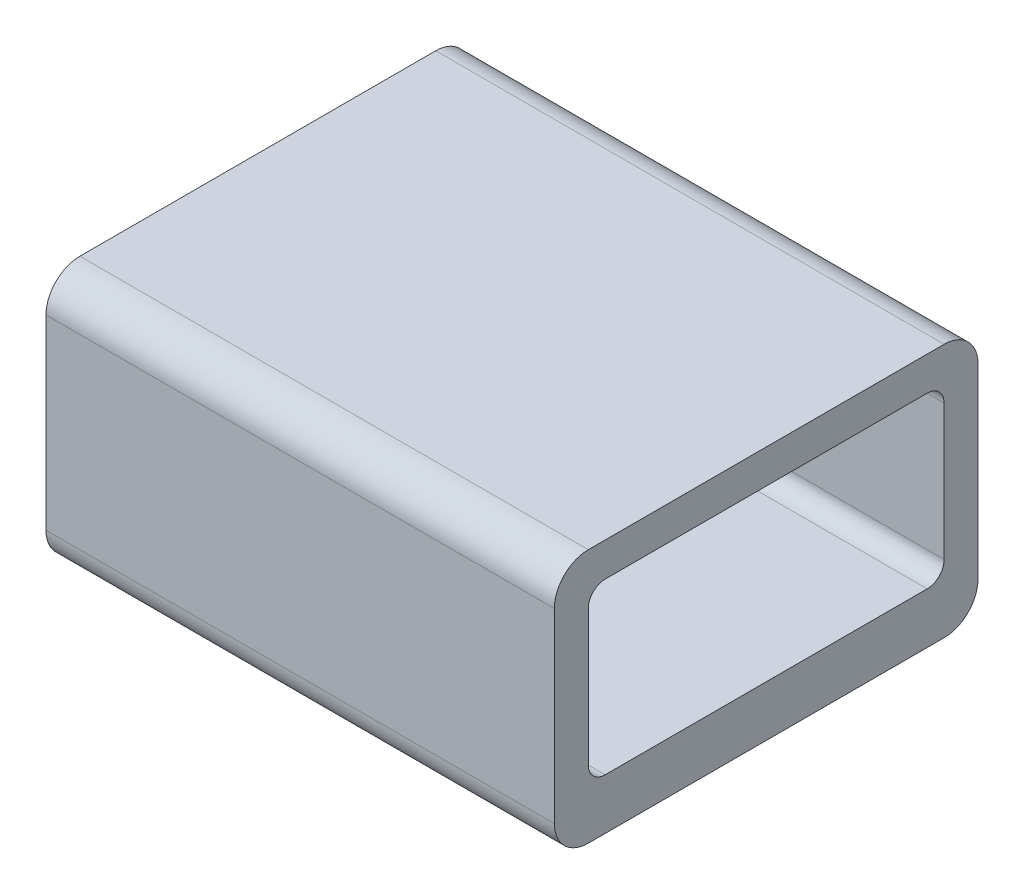
ISO-10303-21;
HEADER;
FILE_DESCRIPTION(('STEP AP214'),'2;1');
FILE_NAME('part.step','',(''),(''),'','','');
FILE_SCHEMA(('AUTOMOTIVE_DESIGN { 1 0 10303 214 1 1 1 1 }'));
ENDSEC;
DATA;
#1=APPLICATION_CONTEXT('core data for automotive mechanical design processes');
#2=APPLICATION_PROTOCOL_DEFINITION('international standard','automotive_design',2000,#1);
#3=PRODUCT_CONTEXT('',#1,'mechanical');
#4=PRODUCT('Part','Part','',(#3));
#5=PRODUCT_RELATED_PRODUCT_CATEGORY('part','',(#4));
#6=PRODUCT_DEFINITION_FORMATION('','',#4);
#7=PRODUCT_DEFINITION_CONTEXT('part definition',#1,'design');
#8=PRODUCT_DEFINITION('design','',#6,#7);
#9=PRODUCT_DEFINITION_SHAPE('','',#8);
#10=(LENGTH_UNIT() NAMED_UNIT(*) SI_UNIT(.MILLI.,.METRE.));
#11=(NAMED_UNIT(*) PLANE_ANGLE_UNIT() SI_UNIT($,.RADIAN.));
#12=(NAMED_UNIT(*) SI_UNIT($,.STERADIAN.) SOLID_ANGLE_UNIT());
#13=UNCERTAINTY_MEASURE_WITH_UNIT(LENGTH_MEASURE(1.E-05),#10,'distance_accuracy_value','');
#14=(GEOMETRIC_REPRESENTATION_CONTEXT(3) GLOBAL_UNCERTAINTY_ASSIGNED_CONTEXT((#13)) GLOBAL_UNIT_ASSIGNED_CONTEXT((#10,
#11,#12)) REPRESENTATION_CONTEXT('',''));
#15=CARTESIAN_POINT('',(0.,0.,0.));
#16=DIRECTION('',(0.,0.,1.));
#17=DIRECTION('',(1.,0.,0.));
#18=AXIS2_PLACEMENT_3D('',#15,#16,#17);
#19=CARTESIAN_POINT('',(30.,0.,0.));
#20=DIRECTION('',(-1.,0.,0.));
#21=DIRECTION('',(0.,0.,1.));
#22=AXIS2_PLACEMENT_3D('',#19,#20,#21);
#23=PLANE('',#22);
#24=DIRECTION('',(0.,0.,-1.));
#25=VECTOR('',#24,1.);
#26=CARTESIAN_POINT('',(30.,-7.5,12.5));
#27=LINE('',#26,#25);
#28=CARTESIAN_POINT('',(30.,-7.5,10.5));
#29=VERTEX_POINT('',#28);
#30=CARTESIAN_POINT('',(30.,-7.5,-10.5));
#31=VERTEX_POINT('',#30);
#32=EDGE_CURVE('E186',#29,#31,#27,.T.);
#33=ORIENTED_EDGE('',*,*,#32,.T.);
#34=CARTESIAN_POINT('',(30.,-5.5,-10.5));
#35=DIRECTION('',(-1.,0.,0.));
#36=DIRECTION('',(0.,0.,1.));
#37=AXIS2_PLACEMENT_3D('',#34,#35,#36);
#38=CIRCLE('',#37,2.);
#39=CARTESIAN_POINT('',(30.,-5.5,-12.5));
#40=VERTEX_POINT('',#39);
#41=EDGE_CURVE('E207',#31,#40,#38,.F.);
#42=ORIENTED_EDGE('',*,*,#41,.T.);
#43=DIRECTION('',(0.,1.,0.));
#44=VECTOR('',#43,1.);
#45=CARTESIAN_POINT('',(30.,-7.5,-12.5));
#46=LINE('',#45,#44);
#47=CARTESIAN_POINT('',(30.,5.5,-12.5));
#48=VERTEX_POINT('',#47);
#49=EDGE_CURVE('E170',#40,#48,#46,.T.);
#50=ORIENTED_EDGE('',*,*,#49,.T.);
#51=CARTESIAN_POINT('',(30.,5.5,-10.5));
#52=DIRECTION('',(-1.,0.,0.));
#53=DIRECTION('',(0.,0.,1.));
#54=AXIS2_PLACEMENT_3D('',#51,#52,#53);
#55=CIRCLE('',#54,2.);
#56=CARTESIAN_POINT('',(30.,7.5,-10.5));
#57=VERTEX_POINT('',#56);
#58=EDGE_CURVE('E201',#48,#57,#55,.F.);
#59=ORIENTED_EDGE('',*,*,#58,.T.);
#60=DIRECTION('',(0.,0.,1.));
#61=VECTOR('',#60,1.);
#62=CARTESIAN_POINT('',(30.,7.5,12.5));
#63=LINE('',#62,#61);
#64=CARTESIAN_POINT('',(30.,7.5,10.5));
#65=VERTEX_POINT('',#64);
#66=EDGE_CURVE('E278',#57,#65,#63,.T.);
#67=ORIENTED_EDGE('',*,*,#66,.T.);
#68=CARTESIAN_POINT('',(30.,5.5,10.5));
#69=DIRECTION('',(-1.,0.,0.));
#70=DIRECTION('',(0.,0.,1.));
#71=AXIS2_PLACEMENT_3D('',#68,#69,#70);
#72=CIRCLE('',#71,2.);
#73=CARTESIAN_POINT('',(30.,5.5,12.5));
#74=VERTEX_POINT('',#73);
#75=EDGE_CURVE('E203',#65,#74,#72,.F.);
#76=ORIENTED_EDGE('',*,*,#75,.T.);
#77=DIRECTION('',(0.,-1.,0.));
#78=VECTOR('',#77,1.);
#79=CARTESIAN_POINT('',(30.,-7.5,12.5));
#80=LINE('',#79,#78);
#81=CARTESIAN_POINT('',(30.,-5.5,12.5));
#82=VERTEX_POINT('',#81);
#83=EDGE_CURVE('E280',#74,#82,#80,.T.);
#84=ORIENTED_EDGE('',*,*,#83,.T.);
#85=CARTESIAN_POINT('',(30.,-5.5,10.5));
#86=DIRECTION('',(-1.,0.,0.));
#87=DIRECTION('',(0.,0.,1.));
#88=AXIS2_PLACEMENT_3D('',#85,#86,#87);
#89=CIRCLE('',#88,2.);
#90=EDGE_CURVE('E205',#82,#29,#89,.F.);
#91=ORIENTED_EDGE('',*,*,#90,.T.);
#92=EDGE_LOOP('',(#33,#42,#50,#59,#67,#76,#84,#91));
#93=FACE_BOUND('',#92,.T.);
#94=DIRECTION('',(0.,0.,-1.));
#95=VECTOR('',#94,1.);
#96=CARTESIAN_POINT('',(30.,-4.5,0.));
#97=LINE('',#96,#95);
#98=CARTESIAN_POINT('',(30.,-4.5,9.50000000000001));
#99=VERTEX_POINT('',#98);
#100=CARTESIAN_POINT('',(30.,-4.5,-9.49999999999999));
#101=VERTEX_POINT('',#100);
#102=EDGE_CURVE('E177',#99,#101,#97,.T.);
#103=ORIENTED_EDGE('',*,*,#102,.F.);
#104=CARTESIAN_POINT('',(30.,-3.5,9.50000000000001));
#105=DIRECTION('',(-1.,0.,0.));
#106=DIRECTION('',(0.,0.,1.));
#107=AXIS2_PLACEMENT_3D('',#104,#105,#106);
#108=CIRCLE('',#107,1.);
#109=CARTESIAN_POINT('',(30.,-3.5,10.5));
#110=VERTEX_POINT('',#109);
#111=EDGE_CURVE('E238',#99,#110,#108,.T.);
#112=ORIENTED_EDGE('',*,*,#111,.T.);
#113=DIRECTION('',(0.,-1.,0.));
#114=VECTOR('',#113,1.);
#115=CARTESIAN_POINT('',(30.,0.,10.5));
#116=LINE('',#115,#114);
#117=CARTESIAN_POINT('',(30.,4.5,10.5));
#118=VERTEX_POINT('',#117);
#119=EDGE_CURVE('E183',#118,#110,#116,.T.);
#120=ORIENTED_EDGE('',*,*,#119,.F.);
#121=CARTESIAN_POINT('',(30.,4.5,9.50000000000001));
#122=DIRECTION('',(-1.,0.,0.));
#123=DIRECTION('',(0.,0.,1.));
#124=AXIS2_PLACEMENT_3D('',#121,#122,#123);
#125=CIRCLE('',#124,1.);
#126=CARTESIAN_POINT('',(30.,5.5,9.50000000000001));
#127=VERTEX_POINT('',#126);
#128=EDGE_CURVE('E242',#118,#127,#125,.T.);
#129=ORIENTED_EDGE('',*,*,#128,.T.);
#130=DIRECTION('',(0.,0.,1.));
#131=VECTOR('',#130,1.);
#132=CARTESIAN_POINT('',(30.,5.5,0.));
#133=LINE('',#132,#131);
#134=CARTESIAN_POINT('',(30.,5.5,-9.49999999999999));
#135=VERTEX_POINT('',#134);
#136=EDGE_CURVE('E254',#135,#127,#133,.T.);
#137=ORIENTED_EDGE('',*,*,#136,.F.);
#138=CARTESIAN_POINT('',(30.,4.5,-9.49999999999999));
#139=DIRECTION('',(-1.,0.,0.));
#140=DIRECTION('',(0.,0.,1.));
#141=AXIS2_PLACEMENT_3D('',#138,#139,#140);
#142=CIRCLE('',#141,1.);
#143=CARTESIAN_POINT('',(30.,4.5,-10.5));
#144=VERTEX_POINT('',#143);
#145=EDGE_CURVE('E44',#135,#144,#142,.T.);
#146=ORIENTED_EDGE('',*,*,#145,.T.);
#147=DIRECTION('',(0.,1.,0.));
#148=VECTOR('',#147,1.);
#149=CARTESIAN_POINT('',(30.,0.,-10.5));
#150=LINE('',#149,#148);
#151=CARTESIAN_POINT('',(30.,-3.5,-10.5));
#152=VERTEX_POINT('',#151);
#153=EDGE_CURVE('E252',#152,#144,#150,.T.);
#154=ORIENTED_EDGE('',*,*,#153,.F.);
#155=CARTESIAN_POINT('',(30.,-3.5,-9.49999999999999));
#156=DIRECTION('',(-1.,0.,0.));
#157=DIRECTION('',(0.,0.,1.));
#158=AXIS2_PLACEMENT_3D('',#155,#156,#157);
#159=CIRCLE('',#158,1.);
#160=EDGE_CURVE('E246',#152,#101,#159,.T.);
#161=ORIENTED_EDGE('',*,*,#160,.T.);
#162=EDGE_LOOP('',(#103,#112,#120,#129,#137,#146,#154,#161));
#163=FACE_BOUND('',#162,.T.);
#164=ADVANCED_FACE('F36',(#93,#163),#23,.F.);
#165=CARTESIAN_POINT('',(0.,0.,0.));
#166=DIRECTION('',(-1.,0.,0.));
#167=DIRECTION('',(0.,0.,1.));
#168=AXIS2_PLACEMENT_3D('',#165,#166,#167);
#169=PLANE('',#168);
#170=DIRECTION('',(0.,1.,0.));
#171=VECTOR('',#170,1.);
#172=CARTESIAN_POINT('',(0.,-7.5,-12.5));
#173=LINE('',#172,#171);
#174=CARTESIAN_POINT('',(0.,-5.5,-12.5));
#175=VERTEX_POINT('',#174);
#176=CARTESIAN_POINT('',(0.,5.5,-12.5));
#177=VERTEX_POINT('',#176);
#178=EDGE_CURVE('E167',#175,#177,#173,.T.);
#179=ORIENTED_EDGE('',*,*,#178,.F.);
#180=CARTESIAN_POINT('',(0.,-5.5,-10.5));
#181=DIRECTION('',(-1.,0.,0.));
#182=DIRECTION('',(0.,0.,1.));
#183=AXIS2_PLACEMENT_3D('',#180,#181,#182);
#184=CIRCLE('',#183,2.);
#185=CARTESIAN_POINT('',(0.,-7.5,-10.5));
#186=VERTEX_POINT('',#185);
#187=EDGE_CURVE('E150',#175,#186,#184,.T.);
#188=ORIENTED_EDGE('',*,*,#187,.T.);
#189=DIRECTION('',(0.,0.,-1.));
#190=VECTOR('',#189,1.);
#191=CARTESIAN_POINT('',(0.,-7.5,12.5));
#192=LINE('',#191,#190);
#193=CARTESIAN_POINT('',(0.,-7.5,10.5));
#194=VERTEX_POINT('',#193);
#195=EDGE_CURVE('E191',#194,#186,#192,.T.);
#196=ORIENTED_EDGE('',*,*,#195,.F.);
#197=CARTESIAN_POINT('',(0.,-5.5,10.5));
#198=DIRECTION('',(-1.,0.,0.));
#199=DIRECTION('',(0.,0.,1.));
#200=AXIS2_PLACEMENT_3D('',#197,#198,#199);
#201=CIRCLE('',#200,2.);
#202=CARTESIAN_POINT('',(0.,-5.5,12.5));
#203=VERTEX_POINT('',#202);
#204=EDGE_CURVE('E161',#194,#203,#201,.T.);
#205=ORIENTED_EDGE('',*,*,#204,.T.);
#206=DIRECTION('',(0.,-1.,0.));
#207=VECTOR('',#206,1.);
#208=CARTESIAN_POINT('',(0.,-7.5,12.5));
#209=LINE('',#208,#207);
#210=CARTESIAN_POINT('',(0.,5.5,12.5));
#211=VERTEX_POINT('',#210);
#212=EDGE_CURVE('E180',#211,#203,#209,.T.);
#213=ORIENTED_EDGE('',*,*,#212,.F.);
#214=CARTESIAN_POINT('',(0.,5.5,10.5));
#215=DIRECTION('',(-1.,0.,0.));
#216=DIRECTION('',(0.,0.,1.));
#217=AXIS2_PLACEMENT_3D('',#214,#215,#216);
#218=CIRCLE('',#217,2.);
#219=CARTESIAN_POINT('',(0.,7.5,10.5));
#220=VERTEX_POINT('',#219);
#221=EDGE_CURVE('E195',#211,#220,#218,.T.);
#222=ORIENTED_EDGE('',*,*,#221,.T.);
#223=DIRECTION('',(0.,0.,1.));
#224=VECTOR('',#223,1.);
#225=CARTESIAN_POINT('',(0.,7.5,12.5));
#226=LINE('',#225,#224);
#227=CARTESIAN_POINT('',(0.,7.5,-10.5));
#228=VERTEX_POINT('',#227);
#229=EDGE_CURVE('E176',#228,#220,#226,.T.);
#230=ORIENTED_EDGE('',*,*,#229,.F.);
#231=CARTESIAN_POINT('',(0.,5.5,-10.5));
#232=DIRECTION('',(-1.,0.,0.));
#233=DIRECTION('',(0.,0.,1.));
#234=AXIS2_PLACEMENT_3D('',#231,#232,#233);
#235=CIRCLE('',#234,2.);
#236=EDGE_CURVE('E171',#228,#177,#235,.T.);
#237=ORIENTED_EDGE('',*,*,#236,.T.);
#238=EDGE_LOOP('',(#179,#188,#196,#205,#213,#222,#230,#237));
#239=FACE_BOUND('',#238,.T.);
#240=DIRECTION('',(0.,-1.,0.));
#241=VECTOR('',#240,1.);
#242=CARTESIAN_POINT('',(0.,0.,10.5));
#243=LINE('',#242,#241);
#244=CARTESIAN_POINT('',(0.,4.5,10.5));
#245=VERTEX_POINT('',#244);
#246=CARTESIAN_POINT('',(0.,-3.5,10.5));
#247=VERTEX_POINT('',#246);
#248=EDGE_CURVE('E271',#245,#247,#243,.T.);
#249=ORIENTED_EDGE('',*,*,#248,.T.);
#250=CARTESIAN_POINT('',(0.,-3.5,9.50000000000001));
#251=DIRECTION('',(-1.,0.,0.));
#252=DIRECTION('',(0.,0.,1.));
#253=AXIS2_PLACEMENT_3D('',#250,#251,#252);
#254=CIRCLE('',#253,1.);
#255=CARTESIAN_POINT('',(0.,-4.5,9.50000000000001));
#256=VERTEX_POINT('',#255);
#257=EDGE_CURVE('E240',#247,#256,#254,.F.);
#258=ORIENTED_EDGE('',*,*,#257,.T.);
#259=DIRECTION('',(0.,0.,-1.));
#260=VECTOR('',#259,1.);
#261=CARTESIAN_POINT('',(0.,-4.5,0.));
#262=LINE('',#261,#260);
#263=CARTESIAN_POINT('',(0.,-4.5,-9.49999999999999));
#264=VERTEX_POINT('',#263);
#265=EDGE_CURVE('E259',#256,#264,#262,.T.);
#266=ORIENTED_EDGE('',*,*,#265,.T.);
#267=CARTESIAN_POINT('',(0.,-3.5,-9.49999999999999));
#268=DIRECTION('',(-1.,0.,0.));
#269=DIRECTION('',(0.,0.,1.));
#270=AXIS2_PLACEMENT_3D('',#267,#268,#269);
#271=CIRCLE('',#270,1.);
#272=CARTESIAN_POINT('',(0.,-3.5,-10.5));
#273=VERTEX_POINT('',#272);
#274=EDGE_CURVE('E58',#264,#273,#271,.F.);
#275=ORIENTED_EDGE('',*,*,#274,.T.);
#276=DIRECTION('',(0.,1.,0.));
#277=VECTOR('',#276,1.);
#278=CARTESIAN_POINT('',(0.,0.,-10.5));
#279=LINE('',#278,#277);
#280=CARTESIAN_POINT('',(0.,4.5,-10.5));
#281=VERTEX_POINT('',#280);
#282=EDGE_CURVE('E267',#273,#281,#279,.T.);
#283=ORIENTED_EDGE('',*,*,#282,.T.);
#284=CARTESIAN_POINT('',(0.,4.5,-9.49999999999999));
#285=DIRECTION('',(-1.,0.,0.));
#286=DIRECTION('',(0.,0.,1.));
#287=AXIS2_PLACEMENT_3D('',#284,#285,#286);
#288=CIRCLE('',#287,1.);
#289=CARTESIAN_POINT('',(0.,5.5,-9.49999999999999));
#290=VERTEX_POINT('',#289);
#291=EDGE_CURVE('E11',#281,#290,#288,.F.);
#292=ORIENTED_EDGE('',*,*,#291,.T.);
#293=DIRECTION('',(0.,0.,1.));
#294=VECTOR('',#293,1.);
#295=CARTESIAN_POINT('',(0.,5.5,0.));
#296=LINE('',#295,#294);
#297=CARTESIAN_POINT('',(0.,5.5,9.50000000000001));
#298=VERTEX_POINT('',#297);
#299=EDGE_CURVE('E265',#290,#298,#296,.T.);
#300=ORIENTED_EDGE('',*,*,#299,.T.);
#301=CARTESIAN_POINT('',(0.,4.5,9.50000000000001));
#302=DIRECTION('',(-1.,0.,0.));
#303=DIRECTION('',(0.,0.,1.));
#304=AXIS2_PLACEMENT_3D('',#301,#302,#303);
#305=CIRCLE('',#304,1.);
#306=EDGE_CURVE('E244',#298,#245,#305,.F.);
#307=ORIENTED_EDGE('',*,*,#306,.T.);
#308=EDGE_LOOP('',(#249,#258,#266,#275,#283,#292,#300,#307));
#309=FACE_BOUND('',#308,.T.);
#310=ADVANCED_FACE('F174',(#239,#309),#169,.T.);
#311=CARTESIAN_POINT('',(30.,-7.5,-12.5));
#312=DIRECTION('',(0.,0.,1.));
#313=DIRECTION('',(1.,0.,0.));
#314=AXIS2_PLACEMENT_3D('',#311,#312,#313);
#315=PLANE('',#314);
#316=ORIENTED_EDGE('',*,*,#49,.F.);
#317=DIRECTION('',(-1.,0.,0.));
#318=VECTOR('',#317,1.);
#319=CARTESIAN_POINT('',(30.,-5.5,-12.5));
#320=LINE('',#319,#318);
#321=EDGE_CURVE('E154',#40,#175,#320,.T.);
#322=ORIENTED_EDGE('',*,*,#321,.T.);
#323=ORIENTED_EDGE('',*,*,#178,.T.);
#324=DIRECTION('',(-1.,0.,0.));
#325=VECTOR('',#324,1.);
#326=CARTESIAN_POINT('',(30.,5.5,-12.5));
#327=LINE('',#326,#325);
#328=EDGE_CURVE('E172',#177,#48,#327,.F.);
#329=ORIENTED_EDGE('',*,*,#328,.T.);
#330=EDGE_LOOP('',(#316,#322,#323,#329));
#331=FACE_BOUND('',#330,.T.);
#332=ADVANCED_FACE('F166',(#331),#315,.F.);
#333=CARTESIAN_POINT('',(30.,7.5,12.5));
#334=DIRECTION('',(0.,-1.,0.));
#335=DIRECTION('',(0.,0.,-1.));
#336=AXIS2_PLACEMENT_3D('',#333,#334,#335);
#337=PLANE('',#336);
#338=ORIENTED_EDGE('',*,*,#229,.T.);
#339=DIRECTION('',(-1.,0.,0.));
#340=VECTOR('',#339,1.);
#341=CARTESIAN_POINT('',(30.,7.5,10.5));
#342=LINE('',#341,#340);
#343=EDGE_CURVE('E217',#220,#65,#342,.F.);
#344=ORIENTED_EDGE('',*,*,#343,.T.);
#345=ORIENTED_EDGE('',*,*,#66,.F.);
#346=DIRECTION('',(-1.,0.,0.));
#347=VECTOR('',#346,1.);
#348=CARTESIAN_POINT('',(30.,7.5,-10.5));
#349=LINE('',#348,#347);
#350=EDGE_CURVE('E214',#57,#228,#349,.T.);
#351=ORIENTED_EDGE('',*,*,#350,.T.);
#352=EDGE_LOOP('',(#338,#344,#345,#351));
#353=FACE_BOUND('',#352,.T.);
#354=ADVANCED_FACE('F302',(#353),#337,.F.);
#355=CARTESIAN_POINT('',(30.,-7.5,12.5));
#356=DIRECTION('',(0.,0.,-1.));
#357=DIRECTION('',(-1.,0.,0.));
#358=AXIS2_PLACEMENT_3D('',#355,#356,#357);
#359=PLANE('',#358);
#360=ORIENTED_EDGE('',*,*,#212,.T.);
#361=DIRECTION('',(-1.,0.,0.));
#362=VECTOR('',#361,1.);
#363=CARTESIAN_POINT('',(30.,-5.5,12.5));
#364=LINE('',#363,#362);
#365=EDGE_CURVE('E212',#203,#82,#364,.F.);
#366=ORIENTED_EDGE('',*,*,#365,.T.);
#367=ORIENTED_EDGE('',*,*,#83,.F.);
#368=DIRECTION('',(-1.,0.,0.));
#369=VECTOR('',#368,1.);
#370=CARTESIAN_POINT('',(30.,5.5,12.5));
#371=LINE('',#370,#369);
#372=EDGE_CURVE('E209',#74,#211,#371,.T.);
#373=ORIENTED_EDGE('',*,*,#372,.T.);
#374=EDGE_LOOP('',(#360,#366,#367,#373));
#375=FACE_BOUND('',#374,.T.);
#376=ADVANCED_FACE('F295',(#375),#359,.F.);
#377=CARTESIAN_POINT('',(30.,-7.5,12.5));
#378=DIRECTION('',(0.,1.,0.));
#379=DIRECTION('',(0.,0.,1.));
#380=AXIS2_PLACEMENT_3D('',#377,#378,#379);
#381=PLANE('',#380);
#382=ORIENTED_EDGE('',*,*,#195,.T.);
#383=DIRECTION('',(-1.,0.,0.));
#384=VECTOR('',#383,1.);
#385=CARTESIAN_POINT('',(30.,-7.5,-10.5));
#386=LINE('',#385,#384);
#387=EDGE_CURVE('E155',#186,#31,#386,.F.);
#388=ORIENTED_EDGE('',*,*,#387,.T.);
#389=ORIENTED_EDGE('',*,*,#32,.F.);
#390=DIRECTION('',(-1.,0.,0.));
#391=VECTOR('',#390,1.);
#392=CARTESIAN_POINT('',(30.,-7.5,10.5));
#393=LINE('',#392,#391);
#394=EDGE_CURVE('E160',#29,#194,#393,.T.);
#395=ORIENTED_EDGE('',*,*,#394,.T.);
#396=EDGE_LOOP('',(#382,#388,#389,#395));
#397=FACE_BOUND('',#396,.T.);
#398=ADVANCED_FACE('F289',(#397),#381,.F.);
#399=CARTESIAN_POINT('',(30.,-5.5,-10.5));
#400=DIRECTION('',(-1.,0.,0.));
#401=DIRECTION('',(0.,0.,1.));
#402=AXIS2_PLACEMENT_3D('',#399,#400,#401);
#403=CYLINDRICAL_SURFACE('',#402,2.);
#404=ORIENTED_EDGE('',*,*,#41,.F.);
#405=ORIENTED_EDGE('',*,*,#387,.F.);
#406=ORIENTED_EDGE('',*,*,#187,.F.);
#407=ORIENTED_EDGE('',*,*,#321,.F.);
#408=EDGE_LOOP('',(#404,#405,#406,#407));
#409=FACE_BOUND('',#408,.T.);
#410=ADVANCED_FACE('F153',(#409),#403,.T.);
#411=CARTESIAN_POINT('',(30.,-5.5,10.5));
#412=DIRECTION('',(-1.,0.,0.));
#413=DIRECTION('',(0.,0.,1.));
#414=AXIS2_PLACEMENT_3D('',#411,#412,#413);
#415=CYLINDRICAL_SURFACE('',#414,2.);
#416=ORIENTED_EDGE('',*,*,#90,.F.);
#417=ORIENTED_EDGE('',*,*,#365,.F.);
#418=ORIENTED_EDGE('',*,*,#204,.F.);
#419=ORIENTED_EDGE('',*,*,#394,.F.);
#420=EDGE_LOOP('',(#416,#417,#418,#419));
#421=FACE_BOUND('',#420,.T.);
#422=ADVANCED_FACE('F291',(#421),#415,.T.);
#423=CARTESIAN_POINT('',(30.,5.5,10.5));
#424=DIRECTION('',(-1.,0.,0.));
#425=DIRECTION('',(0.,0.,1.));
#426=AXIS2_PLACEMENT_3D('',#423,#424,#425);
#427=CYLINDRICAL_SURFACE('',#426,2.);
#428=ORIENTED_EDGE('',*,*,#75,.F.);
#429=ORIENTED_EDGE('',*,*,#343,.F.);
#430=ORIENTED_EDGE('',*,*,#221,.F.);
#431=ORIENTED_EDGE('',*,*,#372,.F.);
#432=EDGE_LOOP('',(#428,#429,#430,#431));
#433=FACE_BOUND('',#432,.T.);
#434=ADVANCED_FACE('F299',(#433),#427,.T.);
#435=CARTESIAN_POINT('',(30.,5.5,-10.5));
#436=DIRECTION('',(-1.,0.,0.));
#437=DIRECTION('',(0.,0.,1.));
#438=AXIS2_PLACEMENT_3D('',#435,#436,#437);
#439=CYLINDRICAL_SURFACE('',#438,2.);
#440=ORIENTED_EDGE('',*,*,#58,.F.);
#441=ORIENTED_EDGE('',*,*,#328,.F.);
#442=ORIENTED_EDGE('',*,*,#236,.F.);
#443=ORIENTED_EDGE('',*,*,#350,.F.);
#444=EDGE_LOOP('',(#440,#441,#442,#443));
#445=FACE_BOUND('',#444,.T.);
#446=ADVANCED_FACE('F307',(#445),#439,.T.);
#447=CARTESIAN_POINT('',(30.,-7.5,-10.5));
#448=DIRECTION('',(0.,0.,1.));
#449=DIRECTION('',(1.,0.,0.));
#450=AXIS2_PLACEMENT_3D('',#447,#448,#449);
#451=PLANE('',#450);
#452=ORIENTED_EDGE('',*,*,#282,.F.);
#453=DIRECTION('',(1.,0.,0.));
#454=VECTOR('',#453,1.);
#455=CARTESIAN_POINT('',(30.,-3.5,-10.5));
#456=LINE('',#455,#454);
#457=EDGE_CURVE('E235',#273,#152,#456,.T.);
#458=ORIENTED_EDGE('',*,*,#457,.T.);
#459=ORIENTED_EDGE('',*,*,#153,.T.);
#460=DIRECTION('',(1.,0.,0.));
#461=VECTOR('',#460,1.);
#462=CARTESIAN_POINT('',(0.,4.5,-10.5));
#463=LINE('',#462,#461);
#464=EDGE_CURVE('E51',#144,#281,#463,.F.);
#465=ORIENTED_EDGE('',*,*,#464,.T.);
#466=EDGE_LOOP('',(#452,#458,#459,#465));
#467=FACE_BOUND('',#466,.T.);
#468=ADVANCED_FACE('F257',(#467),#451,.T.);
#469=CARTESIAN_POINT('',(30.,5.5,12.5));
#470=DIRECTION('',(0.,-1.,0.));
#471=DIRECTION('',(0.,0.,-1.));
#472=AXIS2_PLACEMENT_3D('',#469,#470,#471);
#473=PLANE('',#472);
#474=ORIENTED_EDGE('',*,*,#136,.T.);
#475=DIRECTION('',(1.,0.,0.));
#476=VECTOR('',#475,1.);
#477=CARTESIAN_POINT('',(0.,5.5,9.50000000000001));
#478=LINE('',#477,#476);
#479=EDGE_CURVE('E232',#127,#298,#478,.F.);
#480=ORIENTED_EDGE('',*,*,#479,.T.);
#481=ORIENTED_EDGE('',*,*,#299,.F.);
#482=DIRECTION('',(1.,0.,0.));
#483=VECTOR('',#482,1.);
#484=CARTESIAN_POINT('',(30.,5.5,-9.49999999999999));
#485=LINE('',#484,#483);
#486=EDGE_CURVE('E229',#290,#135,#485,.T.);
#487=ORIENTED_EDGE('',*,*,#486,.T.);
#488=EDGE_LOOP('',(#474,#480,#481,#487));
#489=FACE_BOUND('',#488,.T.);
#490=ADVANCED_FACE('F269',(#489),#473,.T.);
#491=CARTESIAN_POINT('',(30.,-7.5,10.5));
#492=DIRECTION('',(0.,0.,-1.));
#493=DIRECTION('',(-1.,0.,0.));
#494=AXIS2_PLACEMENT_3D('',#491,#492,#493);
#495=PLANE('',#494);
#496=ORIENTED_EDGE('',*,*,#119,.T.);
#497=DIRECTION('',(1.,0.,0.));
#498=VECTOR('',#497,1.);
#499=CARTESIAN_POINT('',(0.,-3.5,10.5));
#500=LINE('',#499,#498);
#501=EDGE_CURVE('E227',#110,#247,#500,.F.);
#502=ORIENTED_EDGE('',*,*,#501,.T.);
#503=ORIENTED_EDGE('',*,*,#248,.F.);
#504=DIRECTION('',(1.,0.,0.));
#505=VECTOR('',#504,1.);
#506=CARTESIAN_POINT('',(30.,4.5,10.5));
#507=LINE('',#506,#505);
#508=EDGE_CURVE('E224',#245,#118,#507,.T.);
#509=ORIENTED_EDGE('',*,*,#508,.T.);
#510=EDGE_LOOP('',(#496,#502,#503,#509));
#511=FACE_BOUND('',#510,.T.);
#512=ADVANCED_FACE('F375',(#511),#495,.T.);
#513=CARTESIAN_POINT('',(30.,-4.5,12.5));
#514=DIRECTION('',(0.,1.,0.));
#515=DIRECTION('',(0.,0.,1.));
#516=AXIS2_PLACEMENT_3D('',#513,#514,#515);
#517=PLANE('',#516);
#518=ORIENTED_EDGE('',*,*,#265,.F.);
#519=DIRECTION('',(1.,0.,0.));
#520=VECTOR('',#519,1.);
#521=CARTESIAN_POINT('',(30.,-4.5,9.50000000000001));
#522=LINE('',#521,#520);
#523=EDGE_CURVE('E221',#256,#99,#522,.T.);
#524=ORIENTED_EDGE('',*,*,#523,.T.);
#525=ORIENTED_EDGE('',*,*,#102,.T.);
#526=DIRECTION('',(1.,0.,0.));
#527=VECTOR('',#526,1.);
#528=CARTESIAN_POINT('',(0.,-4.5,-9.49999999999999));
#529=LINE('',#528,#527);
#530=EDGE_CURVE('E219',#101,#264,#529,.F.);
#531=ORIENTED_EDGE('',*,*,#530,.T.);
#532=EDGE_LOOP('',(#518,#524,#525,#531));
#533=FACE_BOUND('',#532,.T.);
#534=ADVANCED_FACE('F324',(#533),#517,.T.);
#535=CARTESIAN_POINT('',(30.,-3.5,9.50000000000001));
#536=DIRECTION('',(-1.,0.,0.));
#537=DIRECTION('',(0.,0.,1.));
#538=AXIS2_PLACEMENT_3D('',#535,#536,#537);
#539=CYLINDRICAL_SURFACE('',#538,1.);
#540=ORIENTED_EDGE('',*,*,#257,.F.);
#541=ORIENTED_EDGE('',*,*,#501,.F.);
#542=ORIENTED_EDGE('',*,*,#111,.F.);
#543=ORIENTED_EDGE('',*,*,#523,.F.);
#544=EDGE_LOOP('',(#540,#541,#542,#543));
#545=FACE_BOUND('',#544,.T.);
#546=ADVANCED_FACE('F392',(#545),#539,.F.);
#547=CARTESIAN_POINT('',(30.,4.5,9.50000000000001));
#548=DIRECTION('',(-1.,0.,0.));
#549=DIRECTION('',(0.,0.,1.));
#550=AXIS2_PLACEMENT_3D('',#547,#548,#549);
#551=CYLINDRICAL_SURFACE('',#550,1.);
#552=ORIENTED_EDGE('',*,*,#306,.F.);
#553=ORIENTED_EDGE('',*,*,#479,.F.);
#554=ORIENTED_EDGE('',*,*,#128,.F.);
#555=ORIENTED_EDGE('',*,*,#508,.F.);
#556=EDGE_LOOP('',(#552,#553,#554,#555));
#557=FACE_BOUND('',#556,.T.);
#558=ADVANCED_FACE('F401',(#557),#551,.F.);
#559=CARTESIAN_POINT('',(30.,-3.5,-9.49999999999999));
#560=DIRECTION('',(-1.,0.,0.));
#561=DIRECTION('',(0.,0.,1.));
#562=AXIS2_PLACEMENT_3D('',#559,#560,#561);
#563=CYLINDRICAL_SURFACE('',#562,1.);
#564=ORIENTED_EDGE('',*,*,#274,.F.);
#565=ORIENTED_EDGE('',*,*,#530,.F.);
#566=ORIENTED_EDGE('',*,*,#160,.F.);
#567=ORIENTED_EDGE('',*,*,#457,.F.);
#568=EDGE_LOOP('',(#564,#565,#566,#567));
#569=FACE_BOUND('',#568,.T.);
#570=ADVANCED_FACE('F410',(#569),#563,.F.);
#571=CARTESIAN_POINT('',(30.,4.5,-9.49999999999999));
#572=DIRECTION('',(-1.,0.,0.));
#573=DIRECTION('',(0.,0.,1.));
#574=AXIS2_PLACEMENT_3D('',#571,#572,#573);
#575=CYLINDRICAL_SURFACE('',#574,1.);
#576=ORIENTED_EDGE('',*,*,#291,.F.);
#577=ORIENTED_EDGE('',*,*,#464,.F.);
#578=ORIENTED_EDGE('',*,*,#145,.F.);
#579=ORIENTED_EDGE('',*,*,#486,.F.);
#580=EDGE_LOOP('',(#576,#577,#578,#579));
#581=FACE_BOUND('',#580,.T.);
#582=ADVANCED_FACE('F38',(#581),#575,.F.);
#583=CLOSED_SHELL('',(#164,#310,#332,#354,#376,#398,#410,#422,#434,#446,#468,#490,#512,#534,
#546,#558,#570,#582));
#584=MANIFOLD_SOLID_BREP('B2',#583);
#585=ADVANCED_BREP_SHAPE_REPRESENTATION('',(#18,#584),#14);
#586=SHAPE_DEFINITION_REPRESENTATION(#9,#585);
ENDSEC;
END-ISO-10303-21;
